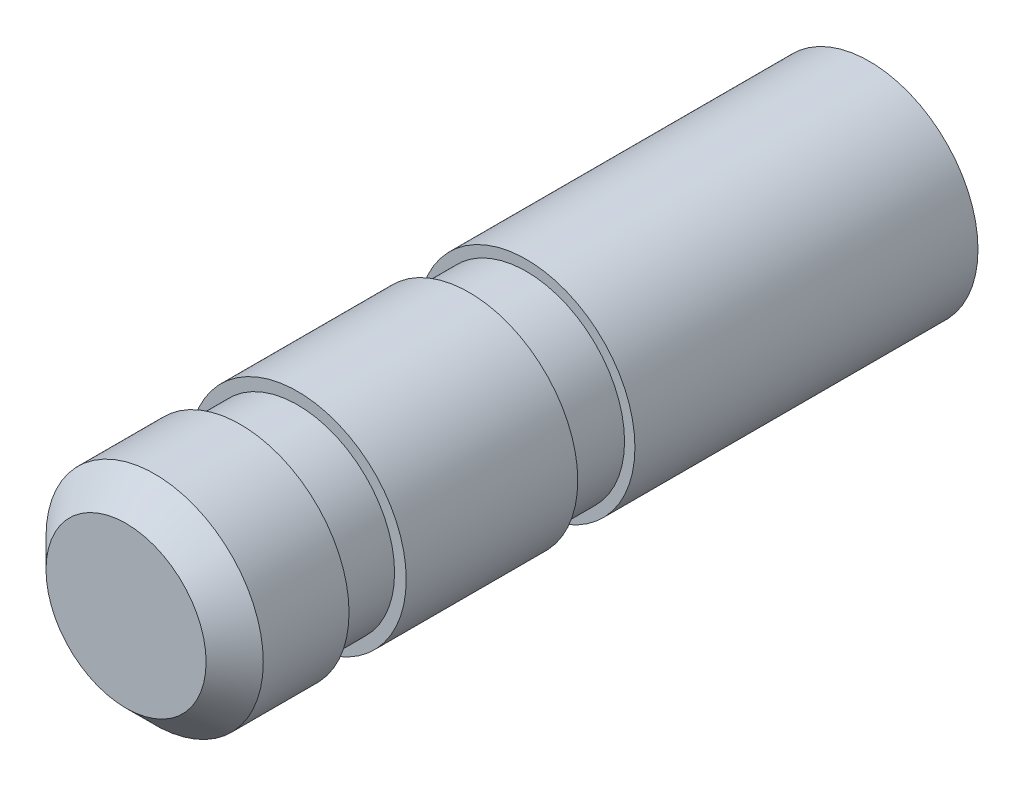
ISO-10303-21;
HEADER;
FILE_DESCRIPTION(('STEP AP214'),'2;1');
FILE_NAME('part.step','',(''),(''),'','','');
FILE_SCHEMA(('AUTOMOTIVE_DESIGN { 1 0 10303 214 1 1 1 1 }'));
ENDSEC;
DATA;
#1=APPLICATION_CONTEXT('core data for automotive mechanical design processes');
#2=APPLICATION_PROTOCOL_DEFINITION('international standard','automotive_design',2000,#1);
#3=PRODUCT_CONTEXT('',#1,'mechanical');
#4=PRODUCT('Part','Part','',(#3));
#5=PRODUCT_RELATED_PRODUCT_CATEGORY('part','',(#4));
#6=PRODUCT_DEFINITION_FORMATION('','',#4);
#7=PRODUCT_DEFINITION_CONTEXT('part definition',#1,'design');
#8=PRODUCT_DEFINITION('design','',#6,#7);
#9=PRODUCT_DEFINITION_SHAPE('','',#8);
#10=(LENGTH_UNIT() NAMED_UNIT(*) SI_UNIT(.MILLI.,.METRE.));
#11=(NAMED_UNIT(*) PLANE_ANGLE_UNIT() SI_UNIT($,.RADIAN.));
#12=(NAMED_UNIT(*) SI_UNIT($,.STERADIAN.) SOLID_ANGLE_UNIT());
#13=UNCERTAINTY_MEASURE_WITH_UNIT(LENGTH_MEASURE(1.E-05),#10,'distance_accuracy_value','');
#14=(GEOMETRIC_REPRESENTATION_CONTEXT(3) GLOBAL_UNCERTAINTY_ASSIGNED_CONTEXT((#13)) GLOBAL_UNIT_ASSIGNED_CONTEXT((#10,
#11,#12)) REPRESENTATION_CONTEXT('',''));
#15=CARTESIAN_POINT('',(0.,0.,0.));
#16=DIRECTION('',(0.,0.,1.));
#17=DIRECTION('',(1.,0.,0.));
#18=AXIS2_PLACEMENT_3D('',#15,#16,#17);
#19=CARTESIAN_POINT('',(0.,0.,13.));
#20=DIRECTION('',(0.,0.,-1.));
#21=DIRECTION('',(-1.,0.,0.));
#22=AXIS2_PLACEMENT_3D('',#19,#20,#21);
#23=CYLINDRICAL_SURFACE('',#22,1.9);
#24=CARTESIAN_POINT('',(0.,0.,10.));
#25=DIRECTION('',(0.,0.,1.));
#26=DIRECTION('',(1.,0.,0.));
#27=AXIS2_PLACEMENT_3D('',#24,#25,#26);
#28=CIRCLE('',#27,1.9);
#29=CARTESIAN_POINT('',(-1.9,0.,10.));
#30=VERTEX_POINT('',#29);
#31=EDGE_CURVE('E71',#30,#30,#28,.T.);
#32=CARTESIAN_POINT('',(0.,0.,7.));
#33=DIRECTION('',(0.,0.,-1.));
#34=DIRECTION('',(-1.,0.,0.));
#35=AXIS2_PLACEMENT_3D('',#32,#33,#34);
#36=CIRCLE('',#35,1.9);
#37=CARTESIAN_POINT('',(-1.9,0.,7.));
#38=VERTEX_POINT('',#37);
#39=EDGE_CURVE('E75',#38,#38,#36,.T.);
#40=CARTESIAN_POINT('',(-1.9,0.,10.));
#41=CARTESIAN_POINT('',(-1.9,0.,9.96875));
#42=CARTESIAN_POINT('',(-1.9,0.,9.9375));
#43=CARTESIAN_POINT('',(-1.9,0.,9.875));
#44=CARTESIAN_POINT('',(-1.9,0.,9.84375));
#45=CARTESIAN_POINT('',(-1.9,0.,9.78125));
#46=CARTESIAN_POINT('',(-1.9,0.,9.75));
#47=CARTESIAN_POINT('',(-1.9,0.,9.6875));
#48=CARTESIAN_POINT('',(-1.9,0.,9.65625));
#49=CARTESIAN_POINT('',(-1.9,0.,9.59375));
#50=CARTESIAN_POINT('',(-1.9,0.,9.5625));
#51=CARTESIAN_POINT('',(-1.9,0.,9.5));
#52=CARTESIAN_POINT('',(-1.9,0.,9.46875));
#53=CARTESIAN_POINT('',(-1.9,0.,9.40625));
#54=CARTESIAN_POINT('',(-1.9,0.,9.375));
#55=CARTESIAN_POINT('',(-1.9,0.,9.3125));
#56=CARTESIAN_POINT('',(-1.9,0.,9.28125));
#57=CARTESIAN_POINT('',(-1.9,0.,9.21875));
#58=CARTESIAN_POINT('',(-1.9,0.,9.1875));
#59=CARTESIAN_POINT('',(-1.9,0.,9.125));
#60=CARTESIAN_POINT('',(-1.9,0.,9.09375));
#61=CARTESIAN_POINT('',(-1.9,0.,9.03125));
#62=CARTESIAN_POINT('',(-1.9,0.,9.));
#63=CARTESIAN_POINT('',(-1.9,0.,8.9375));
#64=CARTESIAN_POINT('',(-1.9,0.,8.90625));
#65=CARTESIAN_POINT('',(-1.9,0.,8.84375));
#66=CARTESIAN_POINT('',(-1.9,0.,8.8125));
#67=CARTESIAN_POINT('',(-1.9,0.,8.75));
#68=CARTESIAN_POINT('',(-1.9,0.,8.71875));
#69=CARTESIAN_POINT('',(-1.9,0.,8.65625));
#70=CARTESIAN_POINT('',(-1.9,0.,8.625));
#71=CARTESIAN_POINT('',(-1.9,0.,8.5625));
#72=CARTESIAN_POINT('',(-1.9,0.,8.53125));
#73=CARTESIAN_POINT('',(-1.9,0.,8.46875));
#74=CARTESIAN_POINT('',(-1.9,0.,8.4375));
#75=CARTESIAN_POINT('',(-1.9,0.,8.375));
#76=CARTESIAN_POINT('',(-1.9,0.,8.34375));
#77=CARTESIAN_POINT('',(-1.9,0.,8.28125));
#78=CARTESIAN_POINT('',(-1.9,0.,8.25));
#79=CARTESIAN_POINT('',(-1.9,0.,8.1875));
#80=CARTESIAN_POINT('',(-1.9,0.,8.15625));
#81=CARTESIAN_POINT('',(-1.9,0.,8.09375));
#82=CARTESIAN_POINT('',(-1.9,0.,8.0625));
#83=CARTESIAN_POINT('',(-1.9,0.,8.));
#84=CARTESIAN_POINT('',(-1.9,0.,7.96875));
#85=CARTESIAN_POINT('',(-1.9,0.,7.90625));
#86=CARTESIAN_POINT('',(-1.9,0.,7.875));
#87=CARTESIAN_POINT('',(-1.9,0.,7.8125));
#88=CARTESIAN_POINT('',(-1.9,0.,7.78125));
#89=CARTESIAN_POINT('',(-1.9,0.,7.71875));
#90=CARTESIAN_POINT('',(-1.9,0.,7.6875));
#91=CARTESIAN_POINT('',(-1.9,0.,7.625));
#92=CARTESIAN_POINT('',(-1.9,0.,7.59375));
#93=CARTESIAN_POINT('',(-1.9,0.,7.53125));
#94=CARTESIAN_POINT('',(-1.9,0.,7.5));
#95=CARTESIAN_POINT('',(-1.9,0.,7.4375));
#96=CARTESIAN_POINT('',(-1.9,0.,7.40625));
#97=CARTESIAN_POINT('',(-1.9,0.,7.34375));
#98=CARTESIAN_POINT('',(-1.9,0.,7.3125));
#99=CARTESIAN_POINT('',(-1.9,0.,7.25));
#100=CARTESIAN_POINT('',(-1.9,0.,7.21875));
#101=CARTESIAN_POINT('',(-1.9,0.,7.15625));
#102=CARTESIAN_POINT('',(-1.9,0.,7.125));
#103=CARTESIAN_POINT('',(-1.9,0.,7.0625));
#104=CARTESIAN_POINT('',(-1.9,0.,7.03125));
#105=CARTESIAN_POINT('',(-1.9,0.,7.));
#106=B_SPLINE_CURVE_WITH_KNOTS('',3,(#40,#41,#42,#43,#44,#45,#46,#47,#48,#49,#50,#51,#52,#53,
#54,#55,#56,#57,#58,#59,#60,#61,#62,#63,#64,#65,#66,#67,#68,#69,#70,#71,#72,#73,#74,#75,#76,#77,
#78,#79,#80,#81,#82,#83,#84,#85,#86,#87,#88,#89,#90,#91,#92,#93,#94,#95,#96,#97,#98,#99,#100,
#101,#102,#103,#104,#105),.UNSPECIFIED.,.F.,.F.,(4,2,2,2,2,2,2,2,2,2,2,2,2,2,2,2,2,2,2,2,2,2,2,
2,2,2,2,2,2,2,2,2,4),(0.,0.0937500000000001,0.187499999999998,0.281249999999999,
0.374999999999999,0.468749999999999,0.562499999999999,0.656249999999999,0.749999999999999,
0.843749999999999,0.937499999999999,1.03125,1.125,1.21875,1.3125,1.40625,1.5,1.59375,1.6875,
1.78125,1.875,1.96875,2.0625,2.15625,2.25,2.34375,2.4375,2.53125,2.625,2.71875,2.8125,2.90625,
3.),.UNSPECIFIED.);
#107=EDGE_CURVE('BSEAM47',#30,#38,#106,.T.);
#108=ORIENTED_EDGE('',*,*,#31,.F.);
#109=ORIENTED_EDGE('',*,*,#39,.F.);
#110=ORIENTED_EDGE('',*,*,#107,.T.);
#111=ORIENTED_EDGE('',*,*,#107,.F.);
#112=EDGE_LOOP('',(#108,#110,#109,#111));
#113=FACE_BOUND('',#112,.T.);
#114=ADVANCED_FACE('F47',(#113),#23,.T.);
#115=CARTESIAN_POINT('',(0.,0.,12.5));
#116=DIRECTION('',(0.,0.,1.));
#117=DIRECTION('',(1.,0.,0.));
#118=AXIS2_PLACEMENT_3D('',#115,#116,#117);
#119=CIRCLE('',#118,1.9);
#120=CARTESIAN_POINT('',(-1.9,0.,12.5));
#121=VERTEX_POINT('',#120);
#122=EDGE_CURVE('E10',#121,#121,#119,.F.);
#123=CARTESIAN_POINT('',(0.,0.,11.));
#124=DIRECTION('',(0.,0.,-1.));
#125=DIRECTION('',(-1.,0.,0.));
#126=AXIS2_PLACEMENT_3D('',#123,#124,#125);
#127=CIRCLE('',#126,1.9);
#128=CARTESIAN_POINT('',(-1.9,0.,11.));
#129=VERTEX_POINT('',#128);
#130=EDGE_CURVE('E67',#129,#129,#127,.T.);
#131=CARTESIAN_POINT('',(-1.9,0.,12.5));
#132=CARTESIAN_POINT('',(-1.9,0.,12.484375));
#133=CARTESIAN_POINT('',(-1.9,0.,12.46875));
#134=CARTESIAN_POINT('',(-1.9,0.,12.4375));
#135=CARTESIAN_POINT('',(-1.9,0.,12.421875));
#136=CARTESIAN_POINT('',(-1.9,0.,12.390625));
#137=CARTESIAN_POINT('',(-1.9,0.,12.375));
#138=CARTESIAN_POINT('',(-1.9,0.,12.34375));
#139=CARTESIAN_POINT('',(-1.9,0.,12.328125));
#140=CARTESIAN_POINT('',(-1.9,0.,12.296875));
#141=CARTESIAN_POINT('',(-1.9,0.,12.28125));
#142=CARTESIAN_POINT('',(-1.9,0.,12.25));
#143=CARTESIAN_POINT('',(-1.9,0.,12.234375));
#144=CARTESIAN_POINT('',(-1.9,0.,12.203125));
#145=CARTESIAN_POINT('',(-1.9,0.,12.1875));
#146=CARTESIAN_POINT('',(-1.9,0.,12.15625));
#147=CARTESIAN_POINT('',(-1.9,0.,12.140625));
#148=CARTESIAN_POINT('',(-1.9,0.,12.109375));
#149=CARTESIAN_POINT('',(-1.9,0.,12.09375));
#150=CARTESIAN_POINT('',(-1.9,0.,12.0625));
#151=CARTESIAN_POINT('',(-1.9,0.,12.046875));
#152=CARTESIAN_POINT('',(-1.9,0.,12.015625));
#153=CARTESIAN_POINT('',(-1.9,0.,12.));
#154=CARTESIAN_POINT('',(-1.9,0.,11.96875));
#155=CARTESIAN_POINT('',(-1.9,0.,11.953125));
#156=CARTESIAN_POINT('',(-1.9,0.,11.921875));
#157=CARTESIAN_POINT('',(-1.9,0.,11.90625));
#158=CARTESIAN_POINT('',(-1.9,0.,11.875));
#159=CARTESIAN_POINT('',(-1.9,0.,11.859375));
#160=CARTESIAN_POINT('',(-1.9,0.,11.828125));
#161=CARTESIAN_POINT('',(-1.9,0.,11.8125));
#162=CARTESIAN_POINT('',(-1.9,0.,11.78125));
#163=CARTESIAN_POINT('',(-1.9,0.,11.765625));
#164=CARTESIAN_POINT('',(-1.9,0.,11.734375));
#165=CARTESIAN_POINT('',(-1.9,0.,11.71875));
#166=CARTESIAN_POINT('',(-1.9,0.,11.6875));
#167=CARTESIAN_POINT('',(-1.9,0.,11.671875));
#168=CARTESIAN_POINT('',(-1.9,0.,11.640625));
#169=CARTESIAN_POINT('',(-1.9,0.,11.625));
#170=CARTESIAN_POINT('',(-1.9,0.,11.59375));
#171=CARTESIAN_POINT('',(-1.9,0.,11.578125));
#172=CARTESIAN_POINT('',(-1.9,0.,11.546875));
#173=CARTESIAN_POINT('',(-1.9,0.,11.53125));
#174=CARTESIAN_POINT('',(-1.9,0.,11.5));
#175=CARTESIAN_POINT('',(-1.9,0.,11.484375));
#176=CARTESIAN_POINT('',(-1.9,0.,11.453125));
#177=CARTESIAN_POINT('',(-1.9,0.,11.4375));
#178=CARTESIAN_POINT('',(-1.9,0.,11.40625));
#179=CARTESIAN_POINT('',(-1.9,0.,11.390625));
#180=CARTESIAN_POINT('',(-1.9,0.,11.359375));
#181=CARTESIAN_POINT('',(-1.9,0.,11.34375));
#182=CARTESIAN_POINT('',(-1.9,0.,11.3125));
#183=CARTESIAN_POINT('',(-1.9,0.,11.296875));
#184=CARTESIAN_POINT('',(-1.9,0.,11.265625));
#185=CARTESIAN_POINT('',(-1.9,0.,11.25));
#186=CARTESIAN_POINT('',(-1.9,0.,11.21875));
#187=CARTESIAN_POINT('',(-1.9,0.,11.203125));
#188=CARTESIAN_POINT('',(-1.9,0.,11.171875));
#189=CARTESIAN_POINT('',(-1.9,0.,11.15625));
#190=CARTESIAN_POINT('',(-1.9,0.,11.125));
#191=CARTESIAN_POINT('',(-1.9,0.,11.109375));
#192=CARTESIAN_POINT('',(-1.9,0.,11.078125));
#193=CARTESIAN_POINT('',(-1.9,0.,11.0625));
#194=CARTESIAN_POINT('',(-1.9,0.,11.03125));
#195=CARTESIAN_POINT('',(-1.9,0.,11.015625));
#196=CARTESIAN_POINT('',(-1.9,0.,11.));
#197=B_SPLINE_CURVE_WITH_KNOTS('',3,(#131,#132,#133,#134,#135,#136,#137,#138,#139,#140,#141,
#142,#143,#144,#145,#146,#147,#148,#149,#150,#151,#152,#153,#154,#155,#156,#157,#158,#159,#160,
#161,#162,#163,#164,#165,#166,#167,#168,#169,#170,#171,#172,#173,#174,#175,#176,#177,#178,#179,
#180,#181,#182,#183,#184,#185,#186,#187,#188,#189,#190,#191,#192,#193,#194,#195,#196),
.UNSPECIFIED.,.F.,.F.,(4,2,2,2,2,2,2,2,2,2,2,2,2,2,2,2,2,2,2,2,2,2,2,2,2,2,2,2,2,2,2,2,4),(0.,
0.046875,0.0937499999999983,0.140624999999998,0.187499999999998,0.234374999999998,
0.281249999999999,0.328124999999999,0.374999999999999,0.421874999999999,0.468749999999999,
0.515624999999999,0.562499999999999,0.609374999999999,0.656249999999999,0.703124999999999,
0.749999999999999,0.796874999999999,0.843749999999999,0.890624999999999,0.937499999999999,
0.984374999999999,1.03125,1.078125,1.125,1.171875,1.21875,1.265625,1.3125,1.359375,1.40625,
1.453125,1.5),.UNSPECIFIED.);
#198=EDGE_CURVE('BSEAM114',#121,#129,#197,.T.);
#199=ORIENTED_EDGE('',*,*,#122,.T.);
#200=ORIENTED_EDGE('',*,*,#130,.F.);
#201=ORIENTED_EDGE('',*,*,#198,.T.);
#202=ORIENTED_EDGE('',*,*,#198,.F.);
#203=EDGE_LOOP('',(#199,#201,#200,#202));
#204=FACE_BOUND('',#203,.T.);
#205=ADVANCED_FACE('F114',(#204),#23,.T.);
#206=CARTESIAN_POINT('',(0.,0.,13.));
#207=DIRECTION('',(0.,0.,1.));
#208=DIRECTION('',(1.,0.,0.));
#209=AXIS2_PLACEMENT_3D('',#206,#207,#208);
#210=PLANE('',#209);
#211=CARTESIAN_POINT('',(0.,0.,13.));
#212=DIRECTION('',(0.,0.,1.));
#213=DIRECTION('',(1.,0.,0.));
#214=AXIS2_PLACEMENT_3D('',#211,#212,#213);
#215=CIRCLE('',#214,1.40000000000001);
#216=CARTESIAN_POINT('',(1.40000000000001,0.,13.));
#217=VERTEX_POINT('',#216);
#218=EDGE_CURVE('E57',#217,#217,#215,.T.);
#219=ORIENTED_EDGE('',*,*,#218,.T.);
#220=EDGE_LOOP('',(#219));
#221=FACE_BOUND('',#220,.T.);
#222=ADVANCED_FACE('F127',(#221),#210,.T.);
#223=CARTESIAN_POINT('',(0.,0.,13.));
#224=DIRECTION('',(0.,0.,-1.));
#225=DIRECTION('',(-1.,0.,0.));
#226=AXIS2_PLACEMENT_3D('',#223,#224,#225);
#227=CONICAL_SURFACE('',#226,1.40000000000001,0.785398163397444);
#228=ORIENTED_EDGE('',*,*,#122,.F.);
#229=EDGE_LOOP('',(#228));
#230=FACE_BOUND('',#229,.T.);
#231=ORIENTED_EDGE('',*,*,#218,.F.);
#232=EDGE_LOOP('',(#231));
#233=FACE_BOUND('',#232,.T.);
#234=ADVANCED_FACE('F50',(#230,#233),#227,.T.);
#235=CARTESIAN_POINT('',(0.,1.69626690889748,10.));
#236=DIRECTION('',(0.,0.,1.));
#237=DIRECTION('',(1.,0.,0.));
#238=AXIS2_PLACEMENT_3D('',#235,#236,#237);
#239=PLANE('',#238);
#240=CARTESIAN_POINT('',(0.,0.,10.));
#241=DIRECTION('',(0.,0.,1.));
#242=DIRECTION('',(1.,0.,0.));
#243=AXIS2_PLACEMENT_3D('',#240,#241,#242);
#244=CIRCLE('',#243,1.69626690889748);
#245=CARTESIAN_POINT('',(1.69626690889748,0.,10.));
#246=VERTEX_POINT('',#245);
#247=EDGE_CURVE('E72',#246,#246,#244,.T.);
#248=ORIENTED_EDGE('',*,*,#247,.F.);
#249=EDGE_LOOP('',(#248));
#250=FACE_BOUND('',#249,.T.);
#251=ORIENTED_EDGE('',*,*,#31,.T.);
#252=EDGE_LOOP('',(#251));
#253=FACE_BOUND('',#252,.T.);
#254=ADVANCED_FACE('F131',(#250,#253),#239,.T.);
#255=CARTESIAN_POINT('',(0.,1.69626690889748,11.));
#256=DIRECTION('',(0.,0.,-1.));
#257=DIRECTION('',(-1.,0.,0.));
#258=AXIS2_PLACEMENT_3D('',#255,#256,#257);
#259=PLANE('',#258);
#260=CARTESIAN_POINT('',(0.,0.,11.));
#261=DIRECTION('',(0.,0.,1.));
#262=DIRECTION('',(1.,0.,0.));
#263=AXIS2_PLACEMENT_3D('',#260,#261,#262);
#264=CIRCLE('',#263,1.69626690889748);
#265=CARTESIAN_POINT('',(1.69626690889748,0.,11.));
#266=VERTEX_POINT('',#265);
#267=EDGE_CURVE('E84',#266,#266,#264,.T.);
#268=ORIENTED_EDGE('',*,*,#267,.T.);
#269=EDGE_LOOP('',(#268));
#270=FACE_BOUND('',#269,.T.);
#271=ORIENTED_EDGE('',*,*,#130,.T.);
#272=EDGE_LOOP('',(#271));
#273=FACE_BOUND('',#272,.T.);
#274=ADVANCED_FACE('F133',(#270,#273),#259,.T.);
#275=CARTESIAN_POINT('',(0.,0.,14.9534622745035));
#276=DIRECTION('',(0.,0.,1.));
#277=DIRECTION('',(1.,0.,0.));
#278=AXIS2_PLACEMENT_3D('',#275,#276,#277);
#279=CYLINDRICAL_SURFACE('',#278,1.69626690889748);
#280=ORIENTED_EDGE('',*,*,#247,.T.);
#281=EDGE_LOOP('',(#280));
#282=FACE_BOUND('',#281,.T.);
#283=ORIENTED_EDGE('',*,*,#267,.F.);
#284=EDGE_LOOP('',(#283));
#285=FACE_BOUND('',#284,.T.);
#286=ADVANCED_FACE('F139',(#282,#285),#279,.T.);
#287=CARTESIAN_POINT('',(0.,2.081566009832,6.));
#288=DIRECTION('',(0.,0.,1.));
#289=DIRECTION('',(1.,0.,0.));
#290=AXIS2_PLACEMENT_3D('',#287,#288,#289);
#291=PLANE('',#290);
#292=CARTESIAN_POINT('',(0.,0.,6.));
#293=DIRECTION('',(0.,0.,1.));
#294=DIRECTION('',(1.,0.,0.));
#295=AXIS2_PLACEMENT_3D('',#292,#293,#294);
#296=CIRCLE('',#295,1.718433990168);
#297=CARTESIAN_POINT('',(1.718433990168,0.,6.));
#298=VERTEX_POINT('',#297);
#299=EDGE_CURVE('E86',#298,#298,#296,.T.);
#300=ORIENTED_EDGE('',*,*,#299,.F.);
#301=EDGE_LOOP('',(#300));
#302=FACE_BOUND('',#301,.T.);
#303=CARTESIAN_POINT('',(0.,0.,6.));
#304=DIRECTION('',(0.,0.,1.));
#305=DIRECTION('',(1.,0.,0.));
#306=AXIS2_PLACEMENT_3D('',#303,#304,#305);
#307=CIRCLE('',#306,1.9);
#308=CARTESIAN_POINT('',(-1.9,0.,6.));
#309=VERTEX_POINT('',#308);
#310=EDGE_CURVE('E52',#309,#309,#307,.T.);
#311=ORIENTED_EDGE('',*,*,#310,.T.);
#312=EDGE_LOOP('',(#311));
#313=FACE_BOUND('',#312,.T.);
#314=ADVANCED_FACE('F180',(#302,#313),#291,.T.);
#315=CARTESIAN_POINT('',(0.,2.081566009832,7.));
#316=DIRECTION('',(0.,0.,-1.));
#317=DIRECTION('',(-1.,0.,0.));
#318=AXIS2_PLACEMENT_3D('',#315,#316,#317);
#319=PLANE('',#318);
#320=CARTESIAN_POINT('',(0.,0.,7.));
#321=DIRECTION('',(0.,0.,1.));
#322=DIRECTION('',(1.,0.,0.));
#323=AXIS2_PLACEMENT_3D('',#320,#321,#322);
#324=CIRCLE('',#323,1.718433990168);
#325=CARTESIAN_POINT('',(1.718433990168,0.,7.));
#326=VERTEX_POINT('',#325);
#327=EDGE_CURVE('E78',#326,#326,#324,.T.);
#328=ORIENTED_EDGE('',*,*,#327,.T.);
#329=EDGE_LOOP('',(#328));
#330=FACE_BOUND('',#329,.T.);
#331=ORIENTED_EDGE('',*,*,#39,.T.);
#332=EDGE_LOOP('',(#331));
#333=FACE_BOUND('',#332,.T.);
#334=ADVANCED_FACE('F116',(#330,#333),#319,.T.);
#335=CARTESIAN_POINT('',(0.,0.,14.3369837130083));
#336=DIRECTION('',(0.,0.,1.));
#337=DIRECTION('',(1.,0.,0.));
#338=AXIS2_PLACEMENT_3D('',#335,#336,#337);
#339=CYLINDRICAL_SURFACE('',#338,1.718433990168);
#340=ORIENTED_EDGE('',*,*,#299,.T.);
#341=EDGE_LOOP('',(#340));
#342=FACE_BOUND('',#341,.T.);
#343=ORIENTED_EDGE('',*,*,#327,.F.);
#344=EDGE_LOOP('',(#343));
#345=FACE_BOUND('',#344,.T.);
#346=ADVANCED_FACE('F108',(#342,#345),#339,.T.);
#347=CARTESIAN_POINT('',(0.,0.,0.));
#348=DIRECTION('',(0.,0.,1.));
#349=DIRECTION('',(1.,0.,0.));
#350=AXIS2_PLACEMENT_3D('',#347,#348,#349);
#351=PLANE('',#350);
#352=CARTESIAN_POINT('',(0.,0.,0.));
#353=DIRECTION('',(0.,0.,1.));
#354=DIRECTION('',(1.,0.,0.));
#355=AXIS2_PLACEMENT_3D('',#352,#353,#354);
#356=CIRCLE('',#355,1.9);
#357=CARTESIAN_POINT('',(-1.9,0.,0.));
#358=VERTEX_POINT('',#357);
#359=EDGE_CURVE('E63',#358,#358,#356,.T.);
#360=ORIENTED_EDGE('',*,*,#359,.F.);
#361=EDGE_LOOP('',(#360));
#362=FACE_BOUND('',#361,.T.);
#363=ADVANCED_FACE('F106',(#362),#351,.F.);
#364=CARTESIAN_POINT('',(-1.9,0.,0.));
#365=CARTESIAN_POINT('',(-1.9,0.,0.0625000000000001));
#366=CARTESIAN_POINT('',(-1.9,0.,0.125));
#367=CARTESIAN_POINT('',(-1.9,0.,0.25));
#368=CARTESIAN_POINT('',(-1.9,0.,0.3125));
#369=CARTESIAN_POINT('',(-1.9,0.,0.4375));
#370=CARTESIAN_POINT('',(-1.9,0.,0.5));
#371=CARTESIAN_POINT('',(-1.9,0.,0.625000000000001));
#372=CARTESIAN_POINT('',(-1.9,0.,0.687500000000001));
#373=CARTESIAN_POINT('',(-1.9,0.,0.8125));
#374=CARTESIAN_POINT('',(-1.9,0.,0.875));
#375=CARTESIAN_POINT('',(-1.9,0.,0.999999999999999));
#376=CARTESIAN_POINT('',(-1.9,0.,1.0625));
#377=CARTESIAN_POINT('',(-1.9,0.,1.1875));
#378=CARTESIAN_POINT('',(-1.9,0.,1.25));
#379=CARTESIAN_POINT('',(-1.9,0.,1.375));
#380=CARTESIAN_POINT('',(-1.9,0.,1.4375));
#381=CARTESIAN_POINT('',(-1.9,0.,1.5625));
#382=CARTESIAN_POINT('',(-1.9,0.,1.625));
#383=CARTESIAN_POINT('',(-1.9,0.,1.75));
#384=CARTESIAN_POINT('',(-1.9,0.,1.8125));
#385=CARTESIAN_POINT('',(-1.9,0.,1.9375));
#386=CARTESIAN_POINT('',(-1.9,0.,2.));
#387=CARTESIAN_POINT('',(-1.9,0.,2.125));
#388=CARTESIAN_POINT('',(-1.9,0.,2.1875));
#389=CARTESIAN_POINT('',(-1.9,0.,2.3125));
#390=CARTESIAN_POINT('',(-1.9,0.,2.375));
#391=CARTESIAN_POINT('',(-1.9,0.,2.5));
#392=CARTESIAN_POINT('',(-1.9,0.,2.5625));
#393=CARTESIAN_POINT('',(-1.9,0.,2.6875));
#394=CARTESIAN_POINT('',(-1.9,0.,2.75));
#395=CARTESIAN_POINT('',(-1.9,0.,2.875));
#396=CARTESIAN_POINT('',(-1.9,0.,2.9375));
#397=CARTESIAN_POINT('',(-1.9,0.,3.0625));
#398=CARTESIAN_POINT('',(-1.9,0.,3.125));
#399=CARTESIAN_POINT('',(-1.9,0.,3.25));
#400=CARTESIAN_POINT('',(-1.9,0.,3.3125));
#401=CARTESIAN_POINT('',(-1.9,0.,3.4375));
#402=CARTESIAN_POINT('',(-1.9,0.,3.5));
#403=CARTESIAN_POINT('',(-1.9,0.,3.625));
#404=CARTESIAN_POINT('',(-1.9,0.,3.6875));
#405=CARTESIAN_POINT('',(-1.9,0.,3.8125));
#406=CARTESIAN_POINT('',(-1.9,0.,3.875));
#407=CARTESIAN_POINT('',(-1.9,0.,4.));
#408=CARTESIAN_POINT('',(-1.9,0.,4.0625));
#409=CARTESIAN_POINT('',(-1.9,0.,4.1875));
#410=CARTESIAN_POINT('',(-1.9,0.,4.25));
#411=CARTESIAN_POINT('',(-1.9,0.,4.375));
#412=CARTESIAN_POINT('',(-1.9,0.,4.4375));
#413=CARTESIAN_POINT('',(-1.9,0.,4.5625));
#414=CARTESIAN_POINT('',(-1.9,0.,4.625));
#415=CARTESIAN_POINT('',(-1.9,0.,4.75));
#416=CARTESIAN_POINT('',(-1.9,0.,4.8125));
#417=CARTESIAN_POINT('',(-1.9,0.,4.9375));
#418=CARTESIAN_POINT('',(-1.9,0.,5.));
#419=CARTESIAN_POINT('',(-1.9,0.,5.125));
#420=CARTESIAN_POINT('',(-1.9,0.,5.1875));
#421=CARTESIAN_POINT('',(-1.9,0.,5.3125));
#422=CARTESIAN_POINT('',(-1.9,0.,5.375));
#423=CARTESIAN_POINT('',(-1.9,0.,5.5));
#424=CARTESIAN_POINT('',(-1.9,0.,5.5625));
#425=CARTESIAN_POINT('',(-1.9,0.,5.6875));
#426=CARTESIAN_POINT('',(-1.9,0.,5.75));
#427=CARTESIAN_POINT('',(-1.9,0.,5.875));
#428=CARTESIAN_POINT('',(-1.9,0.,5.9375));
#429=CARTESIAN_POINT('',(-1.9,0.,6.));
#430=B_SPLINE_CURVE_WITH_KNOTS('',3,(#364,#365,#366,#367,#368,#369,#370,#371,#372,#373,#374,
#375,#376,#377,#378,#379,#380,#381,#382,#383,#384,#385,#386,#387,#388,#389,#390,#391,#392,#393,
#394,#395,#396,#397,#398,#399,#400,#401,#402,#403,#404,#405,#406,#407,#408,#409,#410,#411,#412,
#413,#414,#415,#416,#417,#418,#419,#420,#421,#422,#423,#424,#425,#426,#427,#428,#429),
.UNSPECIFIED.,.F.,.F.,(4,2,2,2,2,2,2,2,2,2,2,2,2,2,2,2,2,2,2,2,2,2,2,2,2,2,2,2,2,2,2,2,4),(0.,
0.1875,0.375,0.5625,0.750000000000001,0.937499999999999,1.125,1.3125,1.5,1.6875,1.875,2.0625,
2.25,2.4375,2.625,2.8125,3.,3.1875,3.375,3.5625,3.75,3.9375,4.125,4.3125,4.5,4.6875,4.875,
5.0625,5.25,5.4375,5.625,5.8125,6.),.UNSPECIFIED.);
#431=EDGE_CURVE('BSEAM103',#358,#309,#430,.T.);
#432=ORIENTED_EDGE('',*,*,#359,.T.);
#433=ORIENTED_EDGE('',*,*,#310,.F.);
#434=ORIENTED_EDGE('',*,*,#431,.T.);
#435=ORIENTED_EDGE('',*,*,#431,.F.);
#436=EDGE_LOOP('',(#432,#434,#433,#435));
#437=FACE_BOUND('',#436,.T.);
#438=ADVANCED_FACE('F103',(#437),#23,.T.);
#439=CLOSED_SHELL('',(#114,#205,#222,#234,#254,#274,#286,#314,#334,#346,#363,#438));
#440=MANIFOLD_SOLID_BREP('B2',#439);
#441=ADVANCED_BREP_SHAPE_REPRESENTATION('',(#18,#440),#14);
#442=SHAPE_DEFINITION_REPRESENTATION(#9,#441);
ENDSEC;
END-ISO-10303-21;
